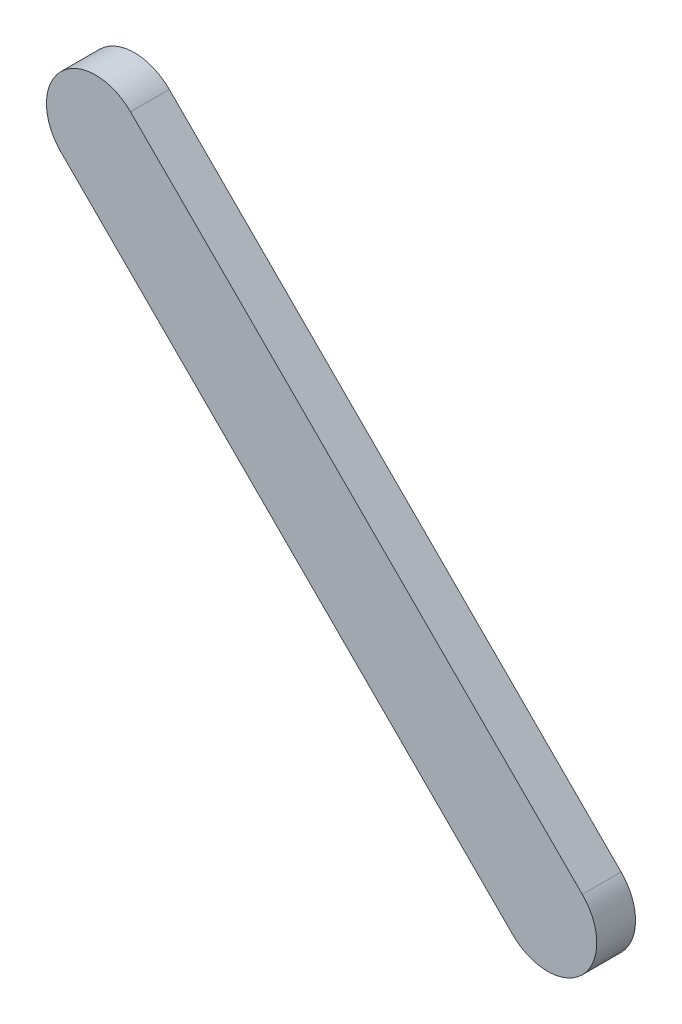
ISO-10303-21;
HEADER;
FILE_DESCRIPTION(('STEP AP214'),'2;1');
FILE_NAME('part.step','',(''),(''),'','','');
FILE_SCHEMA(('AUTOMOTIVE_DESIGN { 1 0 10303 214 1 1 1 1 }'));
ENDSEC;
DATA;
#1=APPLICATION_CONTEXT('core data for automotive mechanical design processes');
#2=APPLICATION_PROTOCOL_DEFINITION('international standard','automotive_design',2000,#1);
#3=PRODUCT_CONTEXT('',#1,'mechanical');
#4=PRODUCT('Part','Part','',(#3));
#5=PRODUCT_RELATED_PRODUCT_CATEGORY('part','',(#4));
#6=PRODUCT_DEFINITION_FORMATION('','',#4);
#7=PRODUCT_DEFINITION_CONTEXT('part definition',#1,'design');
#8=PRODUCT_DEFINITION('design','',#6,#7);
#9=PRODUCT_DEFINITION_SHAPE('','',#8);
#10=(LENGTH_UNIT() NAMED_UNIT(*) SI_UNIT(.MILLI.,.METRE.));
#11=(NAMED_UNIT(*) PLANE_ANGLE_UNIT() SI_UNIT($,.RADIAN.));
#12=(NAMED_UNIT(*) SI_UNIT($,.STERADIAN.) SOLID_ANGLE_UNIT());
#13=UNCERTAINTY_MEASURE_WITH_UNIT(LENGTH_MEASURE(1.E-05),#10,'distance_accuracy_value','');
#14=(GEOMETRIC_REPRESENTATION_CONTEXT(3) GLOBAL_UNCERTAINTY_ASSIGNED_CONTEXT((#13)) GLOBAL_UNIT_ASSIGNED_CONTEXT((#10,
#11,#12)) REPRESENTATION_CONTEXT('',''));
#15=CARTESIAN_POINT('',(0.,0.,0.));
#16=DIRECTION('',(0.,0.,1.));
#17=DIRECTION('',(1.,0.,0.));
#18=AXIS2_PLACEMENT_3D('',#15,#16,#17);
#19=CARTESIAN_POINT('',(127.5315966,66.26679406,0.));
#20=DIRECTION('',(0.70710678118655,0.707106781186545,0.));
#21=DIRECTION('',(0.707106781186545,-0.70710678118655,0.));
#22=AXIS2_PLACEMENT_3D('',#19,#20,#21);
#23=PLANE('',#22);
#24=DIRECTION('',(0.707106781186545,-0.70710678118655,0.));
#25=VECTOR('',#24,1.);
#26=CARTESIAN_POINT('',(127.5315966,66.26679406,0.1999996));
#27=LINE('',#26,#25);
#28=CARTESIAN_POINT('',(127.5315966,66.26679406,0.1999996));
#29=VERTEX_POINT('',#28);
#30=CARTESIAN_POINT('',(129.86199326,63.9363974,0.1999996));
#31=VERTEX_POINT('',#30);
#32=EDGE_CURVE('E11',#29,#31,#27,.T.);
#33=ORIENTED_EDGE('',*,*,#32,.F.);
#34=DIRECTION('',(0.,0.,1.));
#35=VECTOR('',#34,1.);
#36=CARTESIAN_POINT('',(127.5315966,66.26679406,0.));
#37=LINE('',#36,#35);
#38=CARTESIAN_POINT('',(127.5315966,66.26679406,0.));
#39=VERTEX_POINT('',#38);
#40=EDGE_CURVE('E24',#39,#29,#37,.T.);
#41=ORIENTED_EDGE('',*,*,#40,.F.);
#42=DIRECTION('',(0.707106781186545,-0.70710678118655,0.));
#43=VECTOR('',#42,1.);
#44=CARTESIAN_POINT('',(127.5315966,66.26679406,0.));
#45=LINE('',#44,#43);
#46=CARTESIAN_POINT('',(129.86199326,63.9363974,0.));
#47=VERTEX_POINT('',#46);
#48=EDGE_CURVE('E75',#39,#47,#45,.T.);
#49=ORIENTED_EDGE('',*,*,#48,.T.);
#50=DIRECTION('',(0.,0.,1.));
#51=VECTOR('',#50,1.);
#52=CARTESIAN_POINT('',(129.86199326,63.9363974,0.));
#53=LINE('',#52,#51);
#54=EDGE_CURVE('E37',#47,#31,#53,.T.);
#55=ORIENTED_EDGE('',*,*,#54,.T.);
#56=EDGE_LOOP('',(#33,#41,#49,#55));
#57=FACE_BOUND('',#56,.T.);
#58=ADVANCED_FACE('F17',(#57),#23,.F.);
#59=CARTESIAN_POINT('',(130.04159793,64.11600207,0.));
#60=DIRECTION('',(0.,0.,-1.));
#61=DIRECTION('',(-0.707106781186492,-0.707106781186603,0.));
#62=AXIS2_PLACEMENT_3D('',#59,#60,#61);
#63=CYLINDRICAL_SURFACE('',#62,0.253999360179542);
#64=CARTESIAN_POINT('',(130.04159793,64.11600207,0.1999996));
#65=DIRECTION('',(0.,0.,1.));
#66=DIRECTION('',(-0.707106781186492,-0.707106781186603,0.));
#67=AXIS2_PLACEMENT_3D('',#64,#65,#66);
#68=CIRCLE('',#67,0.253999360179542);
#69=CARTESIAN_POINT('',(130.2212026,64.29560674,0.1999996));
#70=VERTEX_POINT('',#69);
#71=EDGE_CURVE('E83',#31,#70,#68,.T.);
#72=ORIENTED_EDGE('',*,*,#71,.F.);
#73=ORIENTED_EDGE('',*,*,#54,.F.);
#74=CARTESIAN_POINT('',(130.04159793,64.11600207,0.));
#75=DIRECTION('',(0.,0.,1.));
#76=DIRECTION('',(-0.707106781186492,-0.707106781186603,0.));
#77=AXIS2_PLACEMENT_3D('',#74,#75,#76);
#78=CIRCLE('',#77,0.253999360179542);
#79=CARTESIAN_POINT('',(130.2212026,64.29560674,0.));
#80=VERTEX_POINT('',#79);
#81=EDGE_CURVE('E81',#47,#80,#78,.T.);
#82=ORIENTED_EDGE('',*,*,#81,.T.);
#83=DIRECTION('',(0.,0.,1.));
#84=VECTOR('',#83,1.);
#85=CARTESIAN_POINT('',(130.2212026,64.29560674,0.));
#86=LINE('',#85,#84);
#87=EDGE_CURVE('E67',#80,#70,#86,.T.);
#88=ORIENTED_EDGE('',*,*,#87,.T.);
#89=EDGE_LOOP('',(#72,#73,#82,#88));
#90=FACE_BOUND('',#89,.T.);
#91=ADVANCED_FACE('F89',(#90),#63,.T.);
#92=CARTESIAN_POINT('',(130.2212026,64.29560674,0.));
#93=DIRECTION('',(-0.707106781186552,-0.707106781186543,0.));
#94=DIRECTION('',(-0.707106781186543,0.707106781186552,0.));
#95=AXIS2_PLACEMENT_3D('',#92,#93,#94);
#96=PLANE('',#95);
#97=DIRECTION('',(-0.707106781186543,0.707106781186552,0.));
#98=VECTOR('',#97,1.);
#99=CARTESIAN_POINT('',(130.2212026,64.29560674,0.1999996));
#100=LINE('',#99,#98);
#101=CARTESIAN_POINT('',(127.89080594,66.6260034,0.1999996));
#102=VERTEX_POINT('',#101);
#103=EDGE_CURVE('E71',#70,#102,#100,.T.);
#104=ORIENTED_EDGE('',*,*,#103,.F.);
#105=ORIENTED_EDGE('',*,*,#87,.F.);
#106=DIRECTION('',(-0.707106781186543,0.707106781186552,0.));
#107=VECTOR('',#106,1.);
#108=CARTESIAN_POINT('',(130.2212026,64.29560674,0.));
#109=LINE('',#108,#107);
#110=CARTESIAN_POINT('',(127.89080594,66.6260034,0.));
#111=VERTEX_POINT('',#110);
#112=EDGE_CURVE('E63',#80,#111,#109,.T.);
#113=ORIENTED_EDGE('',*,*,#112,.T.);
#114=DIRECTION('',(0.,0.,1.));
#115=VECTOR('',#114,1.);
#116=CARTESIAN_POINT('',(127.89080594,66.6260034,0.));
#117=LINE('',#116,#115);
#118=EDGE_CURVE('E53',#111,#102,#117,.T.);
#119=ORIENTED_EDGE('',*,*,#118,.T.);
#120=EDGE_LOOP('',(#104,#105,#113,#119));
#121=FACE_BOUND('',#120,.T.);
#122=ADVANCED_FACE('F66',(#121),#96,.F.);
#123=CARTESIAN_POINT('',(127.71120127,66.44639873,0.));
#124=DIRECTION('',(0.,0.,-1.));
#125=DIRECTION('',(0.70710678118652,0.707106781186576,0.));
#126=AXIS2_PLACEMENT_3D('',#123,#124,#125);
#127=CYLINDRICAL_SURFACE('',#126,0.253999360179546);
#128=CARTESIAN_POINT('',(127.71120127,66.44639873,0.1999996));
#129=DIRECTION('',(0.,0.,1.));
#130=DIRECTION('',(0.70710678118652,0.707106781186576,0.));
#131=AXIS2_PLACEMENT_3D('',#128,#129,#130);
#132=CIRCLE('',#131,0.253999360179546);
#133=EDGE_CURVE('E59',#102,#29,#132,.T.);
#134=ORIENTED_EDGE('',*,*,#133,.F.);
#135=ORIENTED_EDGE('',*,*,#118,.F.);
#136=CARTESIAN_POINT('',(127.71120127,66.44639873,0.));
#137=DIRECTION('',(0.,0.,1.));
#138=DIRECTION('',(0.70710678118652,0.707106781186576,0.));
#139=AXIS2_PLACEMENT_3D('',#136,#137,#138);
#140=CIRCLE('',#139,0.253999360179546);
#141=EDGE_CURVE('E57',#111,#39,#140,.T.);
#142=ORIENTED_EDGE('',*,*,#141,.T.);
#143=ORIENTED_EDGE('',*,*,#40,.T.);
#144=EDGE_LOOP('',(#134,#135,#142,#143));
#145=FACE_BOUND('',#144,.T.);
#146=ADVANCED_FACE('F55',(#145),#127,.T.);
#147=CARTESIAN_POINT('',(127.5315966,66.26679406,0.));
#148=DIRECTION('',(0.,0.,-1.));
#149=DIRECTION('',(-1.,0.,0.));
#150=AXIS2_PLACEMENT_3D('',#147,#148,#149);
#151=PLANE('',#150);
#152=ORIENTED_EDGE('',*,*,#141,.F.);
#153=ORIENTED_EDGE('',*,*,#112,.F.);
#154=ORIENTED_EDGE('',*,*,#81,.F.);
#155=ORIENTED_EDGE('',*,*,#48,.F.);
#156=EDGE_LOOP('',(#152,#153,#154,#155));
#157=FACE_BOUND('',#156,.T.);
#158=ADVANCED_FACE('F74',(#157),#151,.T.);
#159=CARTESIAN_POINT('',(127.5315966,66.26679406,0.1999996));
#160=DIRECTION('',(0.,0.,-1.));
#161=DIRECTION('',(-1.,0.,0.));
#162=AXIS2_PLACEMENT_3D('',#159,#160,#161);
#163=PLANE('',#162);
#164=ORIENTED_EDGE('',*,*,#32,.T.);
#165=ORIENTED_EDGE('',*,*,#71,.T.);
#166=ORIENTED_EDGE('',*,*,#103,.T.);
#167=ORIENTED_EDGE('',*,*,#133,.T.);
#168=EDGE_LOOP('',(#164,#165,#166,#167));
#169=FACE_BOUND('',#168,.T.);
#170=ADVANCED_FACE('F91',(#169),#163,.F.);
#171=CLOSED_SHELL('',(#58,#91,#122,#146,#158,#170));
#172=MANIFOLD_SOLID_BREP('B1',#171);
#173=ADVANCED_BREP_SHAPE_REPRESENTATION('',(#18,#172),#14);
#174=SHAPE_DEFINITION_REPRESENTATION(#9,#173);
ENDSEC;
END-ISO-10303-21;
